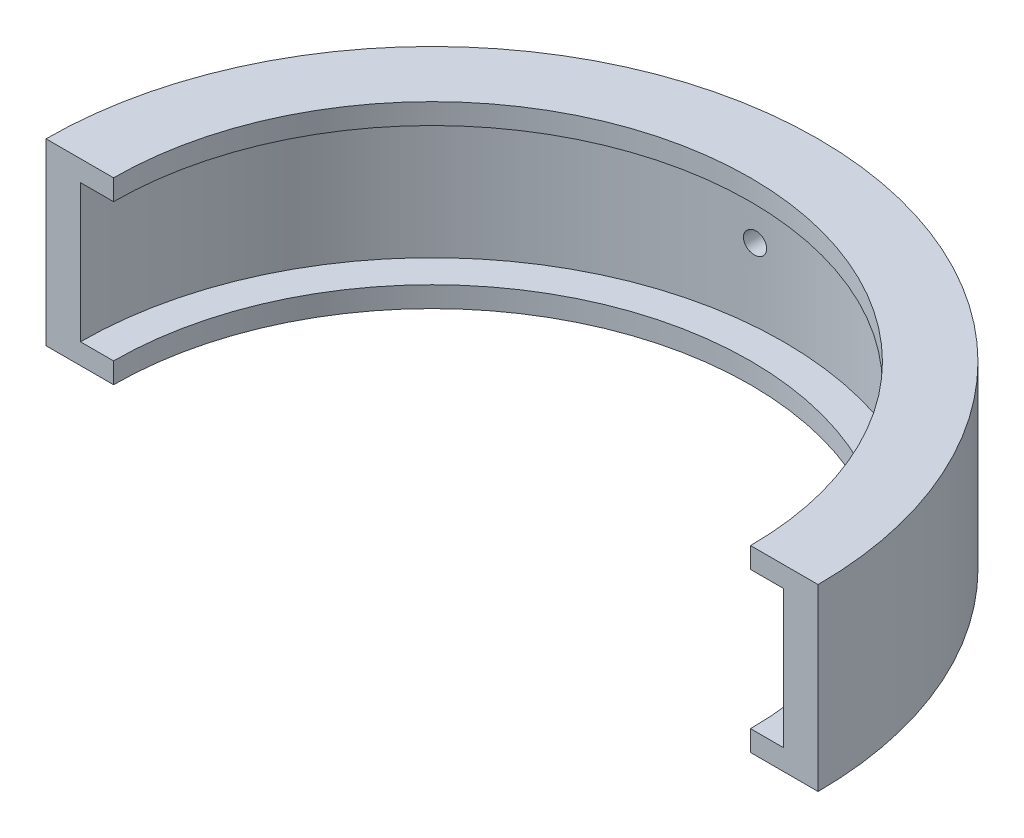
ISO-10303-21;
HEADER;
FILE_DESCRIPTION(('STEP AP214'),'2;1');
FILE_NAME('part.step','',(''),(''),'','','');
FILE_SCHEMA(('AUTOMOTIVE_DESIGN { 1 0 10303 214 1 1 1 1 }'));
ENDSEC;
DATA;
#1=APPLICATION_CONTEXT('core data for automotive mechanical design processes');
#2=APPLICATION_PROTOCOL_DEFINITION('international standard','automotive_design',2000,#1);
#3=PRODUCT_CONTEXT('',#1,'mechanical');
#4=PRODUCT('Part','Part','',(#3));
#5=PRODUCT_RELATED_PRODUCT_CATEGORY('part','',(#4));
#6=PRODUCT_DEFINITION_FORMATION('','',#4);
#7=PRODUCT_DEFINITION_CONTEXT('part definition',#1,'design');
#8=PRODUCT_DEFINITION('design','',#6,#7);
#9=PRODUCT_DEFINITION_SHAPE('','',#8);
#10=(LENGTH_UNIT() NAMED_UNIT(*) SI_UNIT(.MILLI.,.METRE.));
#11=(NAMED_UNIT(*) PLANE_ANGLE_UNIT() SI_UNIT($,.RADIAN.));
#12=(NAMED_UNIT(*) SI_UNIT($,.STERADIAN.) SOLID_ANGLE_UNIT());
#13=UNCERTAINTY_MEASURE_WITH_UNIT(LENGTH_MEASURE(1.E-05),#10,'distance_accuracy_value','');
#14=(GEOMETRIC_REPRESENTATION_CONTEXT(3) GLOBAL_UNCERTAINTY_ASSIGNED_CONTEXT((#13)) GLOBAL_UNIT_ASSIGNED_CONTEXT((#10,
#11,#12)) REPRESENTATION_CONTEXT('',''));
#15=CARTESIAN_POINT('',(0.,0.,0.));
#16=DIRECTION('',(0.,0.,1.));
#17=DIRECTION('',(1.,0.,0.));
#18=AXIS2_PLACEMENT_3D('',#15,#16,#17);
#19=CARTESIAN_POINT('',(48.8419917492533,-11.9850291916085,0.));
#20=DIRECTION('',(0.,1.,0.));
#21=DIRECTION('',(0.,0.,1.));
#22=AXIS2_PLACEMENT_3D('',#19,#20,#21);
#23=CYLINDRICAL_SURFACE('',#22,53.8139090280798);
#24=CARTESIAN_POINT('',(48.8419917492533,-11.9850291916085,0.));
#25=DIRECTION('',(0.,1.,0.));
#26=DIRECTION('',(0.,0.,1.));
#27=AXIS2_PLACEMENT_3D('',#24,#25,#26);
#28=CIRCLE('',#27,53.8139090280798);
#29=CARTESIAN_POINT('',(102.655900777333,-11.9850291916085,3.75780518283485E-13));
#30=VERTEX_POINT('',#29);
#31=CARTESIAN_POINT('',(-4.97191727882648,-11.9850291916085,0.));
#32=VERTEX_POINT('',#31);
#33=EDGE_CURVE('E11',#30,#32,#28,.T.);
#34=ORIENTED_EDGE('',*,*,#33,.T.);
#35=DIRECTION('',(0.,-1.,0.));
#36=VECTOR('',#35,1.);
#37=CARTESIAN_POINT('',(-4.97191727882648,13.,0.));
#38=LINE('',#37,#36);
#39=CARTESIAN_POINT('',(-4.97191727882648,13.,0.));
#40=VERTEX_POINT('',#39);
#41=EDGE_CURVE('E104',#40,#32,#38,.T.);
#42=ORIENTED_EDGE('',*,*,#41,.F.);
#43=CARTESIAN_POINT('',(48.8419917492533,13.,0.));
#44=DIRECTION('',(0.,1.,0.));
#45=DIRECTION('',(0.,0.,1.));
#46=AXIS2_PLACEMENT_3D('',#43,#44,#45);
#47=CIRCLE('',#46,53.8139090280798);
#48=CARTESIAN_POINT('',(102.655900777333,13.,3.75780518283485E-13));
#49=VERTEX_POINT('',#48);
#50=EDGE_CURVE('E54',#49,#40,#47,.T.);
#51=ORIENTED_EDGE('',*,*,#50,.F.);
#52=DIRECTION('',(0.,-1.,0.));
#53=VECTOR('',#52,1.);
#54=CARTESIAN_POINT('',(102.655900777333,13.,3.75780518283485E-13));
#55=LINE('',#54,#53);
#56=EDGE_CURVE('E106',#49,#30,#55,.T.);
#57=ORIENTED_EDGE('',*,*,#56,.T.);
#58=EDGE_LOOP('',(#34,#42,#51,#57));
#59=FACE_BOUND('',#58,.T.);
#60=CARTESIAN_POINT('',(43.5280827211735,0.999999999999999,-53.5509026602142));
#61=CARTESIAN_POINT('',(43.5280864894859,0.916026061639258,-53.5509032124849));
#62=CARTESIAN_POINT('',(43.5351585671625,0.831991476107236,-53.551606266277));
#63=CARTESIAN_POINT('',(43.5632658155453,0.666243785425418,-53.5543840320629));
#64=CARTESIAN_POINT('',(43.5843177039044,0.584533582019019,-53.5564603862958));
#65=CARTESIAN_POINT('',(43.6397653274585,0.425865880593063,-53.5618746537548));
#66=CARTESIAN_POINT('',(43.6741530758578,0.348905569798512,-53.5652118118594));
#67=CARTESIAN_POINT('',(43.7552703467516,0.201878655562843,-53.5729756713357));
#68=CARTESIAN_POINT('',(43.8019969976815,0.131810453360036,-53.5774021191867));
#69=CARTESIAN_POINT('',(43.9065972025722,0.000327316961307893,-53.587138788027));
#70=CARTESIAN_POINT('',(43.9644994998893,-0.0610645811595506,-53.5924512830041));
#71=CARTESIAN_POINT('',(44.0897299072238,-0.173270243998206,-53.603700959857));
#72=CARTESIAN_POINT('',(44.1570585901181,-0.224083365336781,-53.6096381796941));
#73=CARTESIAN_POINT('',(44.2995454907795,-0.313908670738775,-53.6218995722066));
#74=CARTESIAN_POINT('',(44.3747356309809,-0.35287001381656,-53.628225275839));
#75=CARTESIAN_POINT('',(44.5305842410441,-0.417609091550752,-53.6409794590894));
#76=CARTESIAN_POINT('',(44.6112427834447,-0.443386651284397,-53.64740794007));
#77=CARTESIAN_POINT('',(44.7759399570481,-0.481072645677278,-53.6601421984341));
#78=CARTESIAN_POINT('',(44.8599857841084,-0.492949748980866,-53.6664476672411));
#79=CARTESIAN_POINT('',(45.0289025465269,-0.502383015153797,-53.6787138951398));
#80=CARTESIAN_POINT('',(45.1137734792612,-0.499939223551071,-53.6846746553272));
#81=CARTESIAN_POINT('',(45.2818769124863,-0.480790548102006,-53.6960844221485));
#82=CARTESIAN_POINT('',(45.3651103315586,-0.464093907257775,-53.7015337225589));
#83=CARTESIAN_POINT('',(45.5276120826871,-0.416908076908951,-53.7118080577618));
#84=CARTESIAN_POINT('',(45.6068804530843,-0.386419020802428,-53.7166330985915));
#85=CARTESIAN_POINT('',(45.7590165152365,-0.312581416773429,-53.7255792861279));
#86=CARTESIAN_POINT('',(45.8318974763991,-0.269260388456796,-53.7297019097418));
#87=CARTESIAN_POINT('',(45.9693589550585,-0.170956290391664,-53.7372266859339));
#88=CARTESIAN_POINT('',(46.0339395654057,-0.115973351115297,-53.7406288465717));
#89=CARTESIAN_POINT('',(46.1528257551891,0.00397330680233723,-53.74670906731));
#90=CARTESIAN_POINT('',(46.2071517376601,0.0689167305983557,-53.7493885698972));
#91=CARTESIAN_POINT('',(46.3041335266327,0.207022174228034,-53.7540551540827));
#92=CARTESIAN_POINT('',(46.346789407881,0.280184141417921,-53.7560422401158));
#93=CARTESIAN_POINT('',(46.4191666679685,0.432557247424242,-53.7593530564924));
#94=CARTESIAN_POINT('',(46.4489030456507,0.511761245453295,-53.7606775563345));
#95=CARTESIAN_POINT('',(46.4946637056973,0.674043642316246,-53.7626951056274));
#96=CARTESIAN_POINT('',(46.5106880283207,0.757122029774023,-53.7633881569322));
#97=CARTESIAN_POINT('',(46.5285625520451,0.92475368506893,-53.7641602929757));
#98=CARTESIAN_POINT('',(46.530419297144,1.00930625389117,-53.7642396611746));
#99=CARTESIAN_POINT('',(46.5199229633756,1.17752303053264,-53.7637873290861));
#100=CARTESIAN_POINT('',(46.5075699007923,1.2611872393698,-53.763255629499));
#101=CARTESIAN_POINT('',(46.4690084119815,1.42524459723349,-53.7615673461648));
#102=CARTESIAN_POINT('',(46.4428012397752,1.50563804160799,-53.7604108189744));
#103=CARTESIAN_POINT('',(46.3772806164908,1.66088073529579,-53.7574466762048));
#104=CARTESIAN_POINT('',(46.3379671741782,1.735729988317,-53.755639061061));
#105=CARTESIAN_POINT('',(46.2473487015145,1.87777491893239,-53.7513412146363));
#106=CARTESIAN_POINT('',(46.1960415860425,1.94496926268271,-53.7488508646478));
#107=CARTESIAN_POINT('',(46.0829048454156,2.06978746567108,-53.7431618332251));
#108=CARTESIAN_POINT('',(46.0210752038114,2.12741130994784,-53.7399631506837));
#109=CARTESIAN_POINT('',(45.8886157166847,2.23149591685061,-53.7328462698597));
#110=CARTESIAN_POINT('',(45.8179803578935,2.2779496320049,-53.7289276200702));
#111=CARTESIAN_POINT('',(45.6699540538634,2.35834276798356,-53.7203915738958));
#112=CARTESIAN_POINT('',(45.5925630753419,2.39228212714996,-53.7157741740684));
#113=CARTESIAN_POINT('',(45.4331113263296,2.44674101331137,-53.7058909568464));
#114=CARTESIAN_POINT('',(45.3510440695574,2.46724138160472,-53.7006242264063));
#115=CARTESIAN_POINT('',(45.1846690014537,2.49418295000521,-53.6895496696508));
#116=CARTESIAN_POINT('',(45.1003611577765,2.50062394703494,-53.6837418355208));
#117=CARTESIAN_POINT('',(44.931703872012,2.49927925196408,-53.6717208261948));
#118=CARTESIAN_POINT('',(44.8473547373122,2.49146262867741,-53.6655067979855));
#119=CARTESIAN_POINT('',(44.6811822107311,2.46177426869591,-53.6528789105812));
#120=CARTESIAN_POINT('',(44.5993588589551,2.43990230894518,-53.6464650482165));
#121=CARTESIAN_POINT('',(44.4403955512862,2.38266897255333,-53.6336567034008));
#122=CARTESIAN_POINT('',(44.3632647657708,2.34728210794879,-53.6272622807205));
#123=CARTESIAN_POINT('',(44.2160444868483,2.2640194439367,-53.6147636531886));
#124=CARTESIAN_POINT('',(44.1459547480387,2.21614408000187,-53.6086594382263));
#125=CARTESIAN_POINT('',(44.0148265455927,2.10926318092376,-53.5970113039998));
#126=CARTESIAN_POINT('',(43.9537856151214,2.05026068919817,-53.5914672321642));
#127=CARTESIAN_POINT('',(43.842469649101,1.9227588207195,-53.5811974258529));
#128=CARTESIAN_POINT('',(43.7921971242711,1.8542572353149,-53.576471882271));
#129=CARTESIAN_POINT('',(43.7040088124818,1.70990623432587,-53.5680865789999));
#130=CARTESIAN_POINT('',(43.6660617242052,1.63407607654979,-53.5644241220855));
#131=CARTESIAN_POINT('',(43.6034897219046,1.47713158493432,-53.5583410802479));
#132=CARTESIAN_POINT('',(43.578848441063,1.39602388105118,-53.5559189698261));
#133=CARTESIAN_POINT('',(43.5501994954849,1.26199144680052,-53.5530937722598));
#134=CARTESIAN_POINT('',(43.5419163919203,1.20995048757806,-53.5522738775362));
#135=CARTESIAN_POINT('',(43.5308568316443,1.10528096533997,-53.5511781491904));
#136=CARTESIAN_POINT('',(43.5280803584082,1.05265240408812,-53.5509023139356));
#137=CARTESIAN_POINT('',(43.5280827211735,0.999999999999999,-53.5509026602142));
#138=B_SPLINE_CURVE_WITH_KNOTS('',3,(#60,#61,#62,#63,#64,#65,#66,#67,#68,#69,#70,#71,#72,#73,
#74,#75,#76,#77,#78,#79,#80,#81,#82,#83,#84,#85,#86,#87,#88,#89,#90,#91,#92,#93,#94,#95,#96,#97,
#98,#99,#100,#101,#102,#103,#104,#105,#106,#107,#108,#109,#110,#111,#112,#113,#114,#115,#116,
#117,#118,#119,#120,#121,#122,#123,#124,#125,#126,#127,#128,#129,#130,#131,#132,#133,#134,#135,
#136,#137),.UNSPECIFIED.,.T.,.F.,(4,2,2,2,2,2,2,2,2,2,2,2,2,2,2,2,2,2,2,2,2,2,2,2,2,2,2,2,2,2,2,
2,2,2,2,2,2,2,4),(0.,0.251729112940808,0.503759797670985,0.755639774707454,1.00746118469399,
1.25993911516638,1.51243239633908,1.76599400953188,2.01955898689911,2.27369440070877,
2.52782900659033,2.78181673559813,3.0358020081291,3.28924647656472,3.54268810964204,
3.79562004326766,4.04855035683343,4.30118624224078,4.55382138589635,4.80633983042081,
5.05885798556633,5.31135328764262,5.56384842085081,5.81638748346417,6.06892694086061,
6.32162531514143,6.57432493444545,6.82738402482618,7.08044677043737,7.33405917598959,
7.58767560642878,7.84177271683038,8.09586096807519,8.34987982332687,8.60395784030574,
8.85738546934011,9.1105006553015,9.26833751526021,9.42617390157291),.UNSPECIFIED.);
#139=CARTESIAN_POINT('',(43.5280827211735,0.999999999999999,-53.5509026602142));
#140=VERTEX_POINT('',#139);
#141=EDGE_CURVE('E119',#140,#140,#138,.T.);
#142=ORIENTED_EDGE('',*,*,#141,.T.);
#143=EDGE_LOOP('',(#142));
#144=FACE_BOUND('',#143,.T.);
#145=ADVANCED_FACE('F33',(#59,#144),#23,.T.);
#146=CARTESIAN_POINT('',(48.8419917492533,-11.9850291916085,0.));
#147=DIRECTION('',(0.,1.,0.));
#148=DIRECTION('',(0.,0.,1.));
#149=AXIS2_PLACEMENT_3D('',#146,#147,#148);
#150=CYLINDRICAL_SURFACE('',#149,49.0090957220012);
#151=CARTESIAN_POINT('',(48.8419917492533,10.1171120163529,0.));
#152=DIRECTION('',(0.,1.,0.));
#153=DIRECTION('',(0.,0.,1.));
#154=AXIS2_PLACEMENT_3D('',#151,#152,#153);
#155=CIRCLE('',#154,49.0090957220012);
#156=CARTESIAN_POINT('',(97.8510874712546,10.1171120163529,3.42228686293888E-13));
#157=VERTEX_POINT('',#156);
#158=CARTESIAN_POINT('',(-0.167103972747932,10.1171120163529,0.));
#159=VERTEX_POINT('',#158);
#160=EDGE_CURVE('E161',#157,#159,#155,.T.);
#161=ORIENTED_EDGE('',*,*,#160,.T.);
#162=DIRECTION('',(0.,1.,0.));
#163=VECTOR('',#162,1.);
#164=CARTESIAN_POINT('',(-0.16710397274793,-9.10214120796134,0.));
#165=LINE('',#164,#163);
#166=CARTESIAN_POINT('',(-0.16710397274793,-9.10214120796134,0.));
#167=VERTEX_POINT('',#166);
#168=EDGE_CURVE('E129',#167,#159,#165,.T.);
#169=ORIENTED_EDGE('',*,*,#168,.F.);
#170=CARTESIAN_POINT('',(48.8419917492533,-9.10214120796134,0.));
#171=DIRECTION('',(0.,1.,0.));
#172=DIRECTION('',(0.,0.,1.));
#173=AXIS2_PLACEMENT_3D('',#170,#171,#172);
#174=CIRCLE('',#173,49.0090957220012);
#175=CARTESIAN_POINT('',(97.8510874712546,-9.10214120796134,3.42228686293888E-13));
#176=VERTEX_POINT('',#175);
#177=EDGE_CURVE('E163',#176,#167,#174,.T.);
#178=ORIENTED_EDGE('',*,*,#177,.F.);
#179=DIRECTION('',(0.,1.,0.));
#180=VECTOR('',#179,1.);
#181=CARTESIAN_POINT('',(97.8510874712546,-9.10214120796134,3.42228686293888E-13));
#182=LINE('',#181,#180);
#183=EDGE_CURVE('E147',#176,#157,#182,.T.);
#184=ORIENTED_EDGE('',*,*,#183,.T.);
#185=EDGE_LOOP('',(#161,#169,#178,#184));
#186=FACE_BOUND('',#185,.T.);
#187=CARTESIAN_POINT('',(43.5280827211735,0.999999999999999,-48.7201583980345));
#188=CARTESIAN_POINT('',(43.5280864959844,1.08391587424075,-48.7201590055174));
#189=CARTESIAN_POINT('',(43.5351489014967,1.16789230544487,-48.7209307132616));
#190=CARTESIAN_POINT('',(43.5632163615391,1.3335238170443,-48.7239795723923));
#191=CARTESIAN_POINT('',(43.5842380917972,1.41517599909515,-48.7262585243108));
#192=CARTESIAN_POINT('',(43.6396017354981,1.57372825150212,-48.7322005664028));
#193=CARTESIAN_POINT('',(43.6739353445089,1.65063124996528,-48.7358627936024));
#194=CARTESIAN_POINT('',(43.7549187258268,1.79755207896462,-48.7443822531206));
#195=CARTESIAN_POINT('',(43.8015656725813,1.86757148403258,-48.7492392112659));
#196=CARTESIAN_POINT('',(43.9060079316614,1.99900732328397,-48.7599249711342));
#197=CARTESIAN_POINT('',(43.9638375875678,2.06039622231161,-48.7657567590096));
#198=CARTESIAN_POINT('',(44.0889105757098,2.17261054123014,-48.7781059893764));
#199=CARTESIAN_POINT('',(44.1561545211549,2.22343527247669,-48.7846234765246));
#200=CARTESIAN_POINT('',(44.2985274962087,2.3133443830144,-48.7980893786462));
#201=CARTESIAN_POINT('',(44.3736950629985,2.3523674414869,-48.8050398254898));
#202=CARTESIAN_POINT('',(44.5295080364428,2.41723141680491,-48.819054278054));
#203=CARTESIAN_POINT('',(44.6101535331894,2.44307211678895,-48.8261182856409));
#204=CARTESIAN_POINT('',(44.7748763539496,2.48089387439275,-48.8401155054552));
#205=CARTESIAN_POINT('',(44.8589624094766,2.49283707258177,-48.8470483100192));
#206=CARTESIAN_POINT('',(45.0279751781023,2.50238611328806,-48.8605354745369));
#207=CARTESIAN_POINT('',(45.1129018883035,2.49999200520331,-48.8670898357946));
#208=CARTESIAN_POINT('',(45.2811198667747,2.48092280665247,-48.8796354890637));
#209=CARTESIAN_POINT('',(45.3644122290935,2.46425762792498,-48.8856271686722));
#210=CARTESIAN_POINT('',(45.5270403538051,2.41711277395611,-48.8969243306336));
#211=CARTESIAN_POINT('',(45.6063761632869,2.38663326316949,-48.9022298211544));
#212=CARTESIAN_POINT('',(45.7586152444905,2.31280642667076,-48.9120645989982));
#213=CARTESIAN_POINT('',(45.8315345144418,2.26949235226347,-48.9165958449544));
#214=CARTESIAN_POINT('',(45.9690746871804,2.17118705534689,-48.9248665359787));
#215=CARTESIAN_POINT('',(46.0336957013947,2.1161959896596,-48.9286059916792));
#216=CARTESIAN_POINT('',(46.152634273367,1.99624314702418,-48.9352875526907));
#217=CARTESIAN_POINT('',(46.2069764572917,1.93130589323235,-48.9382315711693));
#218=CARTESIAN_POINT('',(46.3039922667175,1.79320587777508,-48.9433589967375));
#219=CARTESIAN_POINT('',(46.3466659827732,1.72004317995034,-48.9455424097299));
#220=CARTESIAN_POINT('',(46.4190689441418,1.56768086735804,-48.9491800472282));
#221=CARTESIAN_POINT('',(46.4488162892865,1.48848987746704,-48.9506352917695));
#222=CARTESIAN_POINT('',(46.4946023877094,1.32623017200395,-48.9528523842896));
#223=CARTESIAN_POINT('',(46.5106411894435,1.24316147013959,-48.9536142347193));
#224=CARTESIAN_POINT('',(46.5285462760039,1.07555409560215,-48.9544636943384));
#225=CARTESIAN_POINT('',(46.5304204563166,0.991016268178043,-48.9545516791469));
#226=CARTESIAN_POINT('',(46.5199636213789,0.822825831822744,-48.9540567798205));
#227=CARTESIAN_POINT('',(46.5076326258987,0.739173221659698,-48.9534738966194));
#228=CARTESIAN_POINT('',(46.4691200511773,0.575137195204131,-48.9516221502553));
#229=CARTESIAN_POINT('',(46.4429399865262,0.494753422453381,-48.9503533621053));
#230=CARTESIAN_POINT('',(46.377478642591,0.339526062401108,-48.947101102879));
#231=CARTESIAN_POINT('',(46.3381973735161,0.264682470782484,-48.9451176323595));
#232=CARTESIAN_POINT('',(46.2476471403223,0.122641555699039,-48.9404013826762));
#233=CARTESIAN_POINT('',(46.1963756659844,0.0554458377464351,-48.9376684465866));
#234=CARTESIAN_POINT('',(46.0833156703468,-0.0693804441282292,-48.9314251437039));
#235=CARTESIAN_POINT('',(46.0215271301065,-0.12701099082349,-48.9279147755107));
#236=CARTESIAN_POINT('',(45.8891474543448,-0.231122984568148,-48.9201038969475));
#237=CARTESIAN_POINT('',(45.8185496819541,-0.277595947482808,-48.9158027896664));
#238=CARTESIAN_POINT('',(45.6706031379962,-0.358034370986091,-48.9064335721115));
#239=CARTESIAN_POINT('',(45.5932543249533,-0.391999754726243,-48.9013654571253));
#240=CARTESIAN_POINT('',(45.4338676308553,-0.446528643879641,-48.8905158436998));
#241=CARTESIAN_POINT('',(45.3518219396149,-0.46706907759669,-48.8847331373539));
#242=CARTESIAN_POINT('',(45.1854905175569,-0.494095819895086,-48.8725732237579));
#243=CARTESIAN_POINT('',(45.1012047486607,-0.500581889414086,-48.866196006397));
#244=CARTESIAN_POINT('',(44.9325515523548,-0.499334422537331,-48.8529928862043));
#245=CARTESIAN_POINT('',(44.8481844893116,-0.491563596526567,-48.8461658518917));
#246=CARTESIAN_POINT('',(44.6819721328162,-0.461962215289465,-48.8322911446414));
#247=CARTESIAN_POINT('',(44.6001268866284,-0.440131396715916,-48.8252434675734));
#248=CARTESIAN_POINT('',(44.4410822846763,-0.382963324454068,-48.8111652432081));
#249=CARTESIAN_POINT('',(44.3638939773989,-0.347595308404342,-48.8041347719019));
#250=CARTESIAN_POINT('',(44.2165568545625,-0.264351549537214,-48.7903914421505));
#251=CARTESIAN_POINT('',(44.1464078006484,-0.216476230425749,-48.7836785729551));
#252=CARTESIAN_POINT('',(44.0151637615176,-0.109574936176962,-48.7708678350066));
#253=CARTESIAN_POINT('',(43.9540660669622,-0.05055230983992,-48.764769782396));
#254=CARTESIAN_POINT('',(43.8426426766119,0.0770135020005699,-48.7534728795726));
#255=CARTESIAN_POINT('',(43.7923194579768,0.145558870917791,-48.7482742361955));
#256=CARTESIAN_POINT('',(43.7040712136718,0.289975349693086,-48.7390521520308));
#257=CARTESIAN_POINT('',(43.6661072364408,0.365822448560793,-48.7350250234361));
#258=CARTESIAN_POINT('',(43.6035065084133,0.522813673745028,-48.7283360751139));
#259=CARTESIAN_POINT('',(43.5788533007895,0.603951119502064,-48.725672569677));
#260=CARTESIAN_POINT('',(43.5501985575399,0.738014355475612,-48.7225666551659));
#261=CARTESIAN_POINT('',(43.5419158749631,0.790053465663055,-48.7216655157841));
#262=CARTESIAN_POINT('',(43.5308567825385,0.894720438759717,-48.7204611977246));
#263=CARTESIAN_POINT('',(43.5280803527276,0.947348299533689,-48.7201580168789));
#264=CARTESIAN_POINT('',(43.5280827211735,0.999999999999999,-48.7201583980345));
#265=B_SPLINE_CURVE_WITH_KNOTS('',3,(#187,#188,#189,#190,#191,#192,#193,#194,#195,#196,#197,
#198,#199,#200,#201,#202,#203,#204,#205,#206,#207,#208,#209,#210,#211,#212,#213,#214,#215,#216,
#217,#218,#219,#220,#221,#222,#223,#224,#225,#226,#227,#228,#229,#230,#231,#232,#233,#234,#235,
#236,#237,#238,#239,#240,#241,#242,#243,#244,#245,#246,#247,#248,#249,#250,#251,#252,#253,#254,
#255,#256,#257,#258,#259,#260,#261,#262,#263,#264),.UNSPECIFIED.,.T.,.F.,(4,2,2,2,2,2,2,2,2,2,2,
2,2,2,2,2,2,2,2,2,2,2,2,2,2,2,2,2,2,2,2,2,2,2,2,2,2,2,4),(0.,0.251554814469485,0.50341067675869,
0.755109674382778,1.0067509645472,1.25917771764007,1.51162092046953,1.76535411794326,
2.0190914894183,2.27351848325619,2.52794460048801,2.78219415340887,3.03644067965797,
3.29003418848171,3.54362429175999,3.79659892381723,4.04957159258054,4.30218889215612,
4.55480529879597,4.80728088440343,5.05975611862444,5.3122037468416,5.56465117834082,
5.81715150856364,6.06965229353265,6.32234447420384,6.57503820742837,6.82816507814977,
7.08129625448244,7.33509045201393,7.58888940331309,7.84326855291317,8.09763908610871,
8.35193332419253,8.60628596443469,8.85982904313987,9.11305793075287,9.27089262987523,
9.42872675675696),.UNSPECIFIED.);
#266=CARTESIAN_POINT('',(43.5280827211735,0.999999999999999,-48.7201583980345));
#267=VERTEX_POINT('',#266);
#268=EDGE_CURVE('E37',#267,#267,#265,.T.);
#269=ORIENTED_EDGE('',*,*,#268,.T.);
#270=EDGE_LOOP('',(#269));
#271=FACE_BOUND('',#270,.T.);
#272=ADVANCED_FACE('F177',(#186,#271),#150,.F.);
#273=CARTESIAN_POINT('',(102.655900777333,-11.9850291916085,3.75780518283485E-13));
#274=DIRECTION('',(0.,-1.,0.));
#275=DIRECTION('',(0.,0.,-1.));
#276=AXIS2_PLACEMENT_3D('',#273,#274,#275);
#277=PLANE('',#276);
#278=CARTESIAN_POINT('',(48.8419917492533,-11.9850291916085,0.));
#279=DIRECTION('',(0.,1.,0.));
#280=DIRECTION('',(0.,0.,1.));
#281=AXIS2_PLACEMENT_3D('',#278,#279,#280);
#282=CIRCLE('',#281,44.3964749481658);
#283=CARTESIAN_POINT('',(93.2384666974191,-11.9850291916085,3.10018927583875E-13));
#284=VERTEX_POINT('',#283);
#285=CARTESIAN_POINT('',(4.44551680108748,-11.9850291916085,0.));
#286=VERTEX_POINT('',#285);
#287=EDGE_CURVE('E47',#284,#286,#282,.T.);
#288=ORIENTED_EDGE('',*,*,#287,.T.);
#289=DIRECTION('',(1.,0.,0.));
#290=VECTOR('',#289,1.);
#291=CARTESIAN_POINT('',(-4.97191727882648,-11.9850291916085,0.));
#292=LINE('',#291,#290);
#293=EDGE_CURVE('E115',#32,#286,#292,.T.);
#294=ORIENTED_EDGE('',*,*,#293,.F.);
#295=ORIENTED_EDGE('',*,*,#33,.F.);
#296=DIRECTION('',(-1.,0.,0.));
#297=VECTOR('',#296,1.);
#298=CARTESIAN_POINT('',(102.655900777333,-11.9850291916085,3.75780518283485E-13));
#299=LINE('',#298,#297);
#300=EDGE_CURVE('E139',#30,#284,#299,.T.);
#301=ORIENTED_EDGE('',*,*,#300,.T.);
#302=EDGE_LOOP('',(#288,#294,#295,#301));
#303=FACE_BOUND('',#302,.T.);
#304=ADVANCED_FACE('F35',(#303),#277,.T.);
#305=CARTESIAN_POINT('',(48.8419917492533,-11.9850291916085,0.));
#306=DIRECTION('',(0.,1.,0.));
#307=DIRECTION('',(0.,0.,1.));
#308=AXIS2_PLACEMENT_3D('',#305,#306,#307);
#309=CYLINDRICAL_SURFACE('',#308,44.3964749481658);
#310=CARTESIAN_POINT('',(48.8419917492533,-9.10214120796134,0.));
#311=DIRECTION('',(0.,1.,0.));
#312=DIRECTION('',(0.,0.,1.));
#313=AXIS2_PLACEMENT_3D('',#310,#311,#312);
#314=CIRCLE('',#313,44.3964749481658);
#315=CARTESIAN_POINT('',(93.2384666974191,-9.10214120796134,3.10018927583875E-13));
#316=VERTEX_POINT('',#315);
#317=CARTESIAN_POINT('',(4.44551680108748,-9.10214120796134,0.));
#318=VERTEX_POINT('',#317);
#319=EDGE_CURVE('E165',#316,#318,#314,.T.);
#320=ORIENTED_EDGE('',*,*,#319,.T.);
#321=DIRECTION('',(0.,1.,0.));
#322=VECTOR('',#321,1.);
#323=CARTESIAN_POINT('',(4.44551680108748,-11.9850291916085,0.));
#324=LINE('',#323,#322);
#325=EDGE_CURVE('E121',#286,#318,#324,.T.);
#326=ORIENTED_EDGE('',*,*,#325,.F.);
#327=ORIENTED_EDGE('',*,*,#287,.F.);
#328=DIRECTION('',(0.,1.,0.));
#329=VECTOR('',#328,1.);
#330=CARTESIAN_POINT('',(93.2384666974191,-11.9850291916085,3.10018927583875E-13));
#331=LINE('',#330,#329);
#332=EDGE_CURVE('E141',#284,#316,#331,.T.);
#333=ORIENTED_EDGE('',*,*,#332,.T.);
#334=EDGE_LOOP('',(#320,#326,#327,#333));
#335=FACE_BOUND('',#334,.T.);
#336=ADVANCED_FACE('F168',(#335),#309,.F.);
#337=CARTESIAN_POINT('',(93.2384666974191,-9.10214120796134,3.10018927583875E-13));
#338=DIRECTION('',(0.,1.,0.));
#339=DIRECTION('',(0.,0.,1.));
#340=AXIS2_PLACEMENT_3D('',#337,#338,#339);
#341=PLANE('',#340);
#342=ORIENTED_EDGE('',*,*,#177,.T.);
#343=DIRECTION('',(-1.,0.,0.));
#344=VECTOR('',#343,1.);
#345=CARTESIAN_POINT('',(4.44551680108748,-9.10214120796134,0.));
#346=LINE('',#345,#344);
#347=EDGE_CURVE('E123',#318,#167,#346,.T.);
#348=ORIENTED_EDGE('',*,*,#347,.F.);
#349=ORIENTED_EDGE('',*,*,#319,.F.);
#350=DIRECTION('',(1.,0.,0.));
#351=VECTOR('',#350,1.);
#352=CARTESIAN_POINT('',(93.2384666974191,-9.10214120796134,3.10018927583875E-13));
#353=LINE('',#352,#351);
#354=EDGE_CURVE('E144',#316,#176,#353,.T.);
#355=ORIENTED_EDGE('',*,*,#354,.T.);
#356=EDGE_LOOP('',(#342,#348,#349,#355));
#357=FACE_BOUND('',#356,.T.);
#358=ADVANCED_FACE('F174',(#357),#341,.T.);
#359=CARTESIAN_POINT('',(97.8510874712546,10.1171120163529,3.42228686293888E-13));
#360=DIRECTION('',(0.,-1.,0.));
#361=DIRECTION('',(0.,0.,-1.));
#362=AXIS2_PLACEMENT_3D('',#359,#360,#361);
#363=PLANE('',#362);
#364=CARTESIAN_POINT('',(48.8419917492533,10.1171120163529,0.));
#365=DIRECTION('',(0.,1.,0.));
#366=DIRECTION('',(0.,0.,1.));
#367=AXIS2_PLACEMENT_3D('',#364,#365,#366);
#368=CIRCLE('',#367,44.3964749481658);
#369=CARTESIAN_POINT('',(93.2384666974191,10.1171120163529,3.10018927583875E-13));
#370=VERTEX_POINT('',#369);
#371=CARTESIAN_POINT('',(4.44551680108748,10.1171120163529,0.));
#372=VERTEX_POINT('',#371);
#373=EDGE_CURVE('E159',#370,#372,#368,.T.);
#374=ORIENTED_EDGE('',*,*,#373,.T.);
#375=DIRECTION('',(1.,0.,0.));
#376=VECTOR('',#375,1.);
#377=CARTESIAN_POINT('',(-0.167103972747932,10.1171120163529,0.));
#378=LINE('',#377,#376);
#379=EDGE_CURVE('E132',#159,#372,#378,.T.);
#380=ORIENTED_EDGE('',*,*,#379,.F.);
#381=ORIENTED_EDGE('',*,*,#160,.F.);
#382=DIRECTION('',(-1.,0.,0.));
#383=VECTOR('',#382,1.);
#384=CARTESIAN_POINT('',(97.8510874712546,10.1171120163529,3.42228686293888E-13));
#385=LINE('',#384,#383);
#386=EDGE_CURVE('E150',#157,#370,#385,.T.);
#387=ORIENTED_EDGE('',*,*,#386,.T.);
#388=EDGE_LOOP('',(#374,#380,#381,#387));
#389=FACE_BOUND('',#388,.T.);
#390=ADVANCED_FACE('F183',(#389),#363,.T.);
#391=CARTESIAN_POINT('',(48.8419917492533,-11.9850291916085,0.));
#392=DIRECTION('',(0.,1.,0.));
#393=DIRECTION('',(0.,0.,1.));
#394=AXIS2_PLACEMENT_3D('',#391,#392,#393);
#395=CYLINDRICAL_SURFACE('',#394,44.3964749481658);
#396=CARTESIAN_POINT('',(48.8419917492533,13.,0.));
#397=DIRECTION('',(0.,1.,0.));
#398=DIRECTION('',(0.,0.,1.));
#399=AXIS2_PLACEMENT_3D('',#396,#397,#398);
#400=CIRCLE('',#399,44.3964749481658);
#401=CARTESIAN_POINT('',(93.2384666974191,13.,3.10018927583875E-13));
#402=VERTEX_POINT('',#401);
#403=CARTESIAN_POINT('',(4.44551680108748,13.,0.));
#404=VERTEX_POINT('',#403);
#405=EDGE_CURVE('E62',#402,#404,#400,.T.);
#406=ORIENTED_EDGE('',*,*,#405,.T.);
#407=DIRECTION('',(0.,1.,0.));
#408=VECTOR('',#407,1.);
#409=CARTESIAN_POINT('',(4.44551680108748,10.1171120163529,0.));
#410=LINE('',#409,#408);
#411=EDGE_CURVE('E135',#372,#404,#410,.T.);
#412=ORIENTED_EDGE('',*,*,#411,.F.);
#413=ORIENTED_EDGE('',*,*,#373,.F.);
#414=DIRECTION('',(0.,1.,0.));
#415=VECTOR('',#414,1.);
#416=CARTESIAN_POINT('',(93.2384666974191,10.1171120163529,3.10018927583875E-13));
#417=LINE('',#416,#415);
#418=EDGE_CURVE('E153',#370,#402,#417,.T.);
#419=ORIENTED_EDGE('',*,*,#418,.T.);
#420=EDGE_LOOP('',(#406,#412,#413,#419));
#421=FACE_BOUND('',#420,.T.);
#422=ADVANCED_FACE('F186',(#421),#395,.F.);
#423=CARTESIAN_POINT('',(93.2384666974191,13.,3.10018927583875E-13));
#424=DIRECTION('',(0.,1.,0.));
#425=DIRECTION('',(0.,0.,1.));
#426=AXIS2_PLACEMENT_3D('',#423,#424,#425);
#427=PLANE('',#426);
#428=DIRECTION('',(1.,0.,0.));
#429=VECTOR('',#428,1.);
#430=CARTESIAN_POINT('',(93.2384666974191,13.,3.10018927583875E-13));
#431=LINE('',#430,#429);
#432=EDGE_CURVE('E155',#402,#49,#431,.T.);
#433=ORIENTED_EDGE('',*,*,#432,.T.);
#434=ORIENTED_EDGE('',*,*,#50,.T.);
#435=DIRECTION('',(-1.,0.,0.));
#436=VECTOR('',#435,1.);
#437=CARTESIAN_POINT('',(4.44551680108748,13.,0.));
#438=LINE('',#437,#436);
#439=EDGE_CURVE('E118',#404,#40,#438,.T.);
#440=ORIENTED_EDGE('',*,*,#439,.F.);
#441=ORIENTED_EDGE('',*,*,#405,.F.);
#442=EDGE_LOOP('',(#433,#434,#440,#441));
#443=FACE_BOUND('',#442,.T.);
#444=ADVANCED_FACE('F188',(#443),#427,.T.);
#445=CARTESIAN_POINT('',(97.6839834985066,0.,3.41061805488896E-13));
#446=DIRECTION('',(0.,0.,-1.));
#447=DIRECTION('',(-1.,0.,0.));
#448=AXIS2_PLACEMENT_3D('',#445,#446,#447);
#449=PLANE('',#448);
#450=ORIENTED_EDGE('',*,*,#56,.F.);
#451=ORIENTED_EDGE('',*,*,#432,.F.);
#452=ORIENTED_EDGE('',*,*,#418,.F.);
#453=ORIENTED_EDGE('',*,*,#386,.F.);
#454=ORIENTED_EDGE('',*,*,#183,.F.);
#455=ORIENTED_EDGE('',*,*,#354,.F.);
#456=ORIENTED_EDGE('',*,*,#332,.F.);
#457=ORIENTED_EDGE('',*,*,#300,.F.);
#458=EDGE_LOOP('',(#450,#451,#452,#453,#454,#455,#456,#457));
#459=FACE_BOUND('',#458,.T.);
#460=ADVANCED_FACE('F190',(#459),#449,.F.);
#461=CARTESIAN_POINT('',(0.,0.,0.));
#462=DIRECTION('',(0.,0.,1.));
#463=DIRECTION('',(1.,0.,0.));
#464=AXIS2_PLACEMENT_3D('',#461,#462,#463);
#465=PLANE('',#464);
#466=ORIENTED_EDGE('',*,*,#41,.T.);
#467=ORIENTED_EDGE('',*,*,#293,.T.);
#468=ORIENTED_EDGE('',*,*,#325,.T.);
#469=ORIENTED_EDGE('',*,*,#347,.T.);
#470=ORIENTED_EDGE('',*,*,#168,.T.);
#471=ORIENTED_EDGE('',*,*,#379,.T.);
#472=ORIENTED_EDGE('',*,*,#411,.T.);
#473=ORIENTED_EDGE('',*,*,#439,.T.);
#474=EDGE_LOOP('',(#466,#467,#468,#469,#470,#471,#472,#473));
#475=FACE_BOUND('',#474,.T.);
#476=ADVANCED_FACE('F113',(#475),#465,.T.);
#477=CARTESIAN_POINT('',(45.0280827211735,0.999999999999999,-33.));
#478=DIRECTION('',(0.,0.,-1.));
#479=DIRECTION('',(-1.,0.,0.));
#480=AXIS2_PLACEMENT_3D('',#477,#478,#479);
#481=CYLINDRICAL_SURFACE('',#480,1.5);
#482=ORIENTED_EDGE('',*,*,#141,.F.);
#483=EDGE_LOOP('',(#482));
#484=FACE_BOUND('',#483,.T.);
#485=ORIENTED_EDGE('',*,*,#268,.F.);
#486=EDGE_LOOP('',(#485));
#487=FACE_BOUND('',#486,.T.);
#488=ADVANCED_FACE('F197',(#484,#487),#481,.F.);
#489=CLOSED_SHELL('',(#145,#272,#304,#336,#358,#390,#422,#444,#460,#476,#488));
#490=MANIFOLD_SOLID_BREP('B2',#489);
#491=ADVANCED_BREP_SHAPE_REPRESENTATION('',(#18,#490),#14);
#492=SHAPE_DEFINITION_REPRESENTATION(#9,#491);
ENDSEC;
END-ISO-10303-21;
